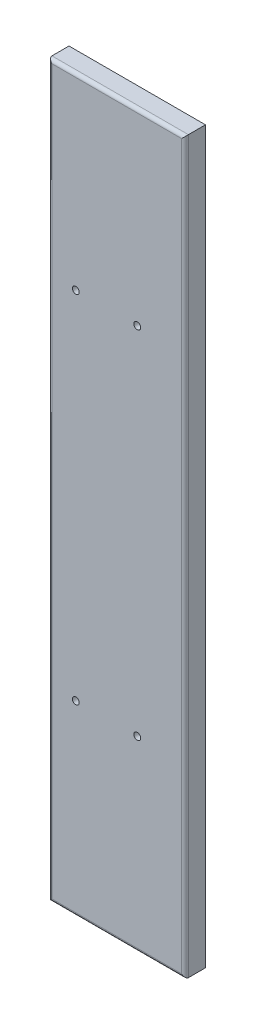
ISO-10303-21;
HEADER;
FILE_DESCRIPTION(('STEP AP214'),'2;1');
FILE_NAME('part.step','',(''),(''),'','','');
FILE_SCHEMA(('AUTOMOTIVE_DESIGN { 1 0 10303 214 1 1 1 1 }'));
ENDSEC;
DATA;
#1=APPLICATION_CONTEXT('core data for automotive mechanical design processes');
#2=APPLICATION_PROTOCOL_DEFINITION('international standard','automotive_design',2000,#1);
#3=PRODUCT_CONTEXT('',#1,'mechanical');
#4=PRODUCT('Part','Part','',(#3));
#5=PRODUCT_RELATED_PRODUCT_CATEGORY('part','',(#4));
#6=PRODUCT_DEFINITION_FORMATION('','',#4);
#7=PRODUCT_DEFINITION_CONTEXT('part definition',#1,'design');
#8=PRODUCT_DEFINITION('design','',#6,#7);
#9=PRODUCT_DEFINITION_SHAPE('','',#8);
#10=(LENGTH_UNIT() NAMED_UNIT(*) SI_UNIT(.MILLI.,.METRE.));
#11=(NAMED_UNIT(*) PLANE_ANGLE_UNIT() SI_UNIT($,.RADIAN.));
#12=(NAMED_UNIT(*) SI_UNIT($,.STERADIAN.) SOLID_ANGLE_UNIT());
#13=UNCERTAINTY_MEASURE_WITH_UNIT(LENGTH_MEASURE(1.E-05),#10,'distance_accuracy_value','');
#14=(GEOMETRIC_REPRESENTATION_CONTEXT(3) GLOBAL_UNCERTAINTY_ASSIGNED_CONTEXT((#13)) GLOBAL_UNIT_ASSIGNED_CONTEXT((#10,
#11,#12)) REPRESENTATION_CONTEXT('',''));
#15=CARTESIAN_POINT('',(0.,0.,0.));
#16=DIRECTION('',(0.,0.,1.));
#17=DIRECTION('',(1.,0.,0.));
#18=AXIS2_PLACEMENT_3D('',#15,#16,#17);
#19=CARTESIAN_POINT('',(0.,0.,19.05));
#20=DIRECTION('',(0.,0.,-1.));
#21=DIRECTION('',(-1.,0.,0.));
#22=AXIS2_PLACEMENT_3D('',#19,#20,#21);
#23=PLANE('',#22);
#24=DIRECTION('',(-1.,0.,0.));
#25=VECTOR('',#24,1.);
#26=CARTESIAN_POINT('',(73.0250000000002,-501.65,19.05));
#27=LINE('',#26,#25);
#28=CARTESIAN_POINT('',(-50.7999999999997,-501.65,19.05));
#29=VERTEX_POINT('',#28);
#30=CARTESIAN_POINT('',(69.8500000000002,-501.65,19.05));
#31=VERTEX_POINT('',#30);
#32=EDGE_CURVE('E130',#29,#31,#27,.F.);
#33=ORIENTED_EDGE('',*,*,#32,.T.);
#34=DIRECTION('',(0.,-1.,0.));
#35=VECTOR('',#34,1.);
#36=CARTESIAN_POINT('',(69.8500000000002,174.625,19.05));
#37=LINE('',#36,#35);
#38=CARTESIAN_POINT('',(69.8500000000002,171.45,19.05));
#39=VERTEX_POINT('',#38);
#40=EDGE_CURVE('E135',#31,#39,#37,.F.);
#41=ORIENTED_EDGE('',*,*,#40,.T.);
#42=DIRECTION('',(1.,0.,0.));
#43=VECTOR('',#42,1.);
#44=CARTESIAN_POINT('',(-53.9749999999997,171.45,19.05));
#45=LINE('',#44,#43);
#46=CARTESIAN_POINT('',(-50.7999999999997,171.45,19.05));
#47=VERTEX_POINT('',#46);
#48=EDGE_CURVE('E132',#39,#47,#45,.F.);
#49=ORIENTED_EDGE('',*,*,#48,.T.);
#50=DIRECTION('',(0.,1.,0.));
#51=VECTOR('',#50,1.);
#52=CARTESIAN_POINT('',(-50.7999999999997,-504.825,19.05));
#53=LINE('',#52,#51);
#54=EDGE_CURVE('E128',#47,#29,#53,.F.);
#55=ORIENTED_EDGE('',*,*,#54,.T.);
#56=EDGE_LOOP('',(#33,#41,#49,#55));
#57=FACE_BOUND('',#56,.T.);
#58=CARTESIAN_POINT('',(-28.575,2.47467228388285E-13,19.05));
#59=DIRECTION('',(0.,0.,1.));
#60=DIRECTION('',(1.,0.,0.));
#61=AXIS2_PLACEMENT_3D('',#58,#59,#60);
#62=CIRCLE('',#61,3.17499999999999);
#63=CARTESIAN_POINT('',(-25.4,2.47467228388285E-13,19.05));
#64=VERTEX_POINT('',#63);
#65=EDGE_CURVE('E154',#64,#64,#62,.T.);
#66=ORIENTED_EDGE('',*,*,#65,.F.);
#67=EDGE_LOOP('',(#66));
#68=FACE_BOUND('',#67,.T.);
#69=CARTESIAN_POINT('',(-28.575,-330.91179998754,19.05));
#70=DIRECTION('',(0.,0.,1.));
#71=DIRECTION('',(1.,0.,0.));
#72=AXIS2_PLACEMENT_3D('',#69,#70,#71);
#73=CIRCLE('',#72,3.17499999999999);
#74=CARTESIAN_POINT('',(-25.4,-330.91179998754,19.05));
#75=VERTEX_POINT('',#74);
#76=EDGE_CURVE('E176',#75,#75,#73,.T.);
#77=ORIENTED_EDGE('',*,*,#76,.F.);
#78=EDGE_LOOP('',(#77));
#79=FACE_BOUND('',#78,.T.);
#80=CARTESIAN_POINT('',(28.575,-330.91179998754,19.05));
#81=DIRECTION('',(0.,0.,1.));
#82=DIRECTION('',(1.,0.,0.));
#83=AXIS2_PLACEMENT_3D('',#80,#81,#82);
#84=CIRCLE('',#83,3.17499999999999);
#85=CARTESIAN_POINT('',(31.75,-330.91179998754,19.05));
#86=VERTEX_POINT('',#85);
#87=EDGE_CURVE('E116',#86,#86,#84,.T.);
#88=ORIENTED_EDGE('',*,*,#87,.F.);
#89=EDGE_LOOP('',(#88));
#90=FACE_BOUND('',#89,.T.);
#91=CARTESIAN_POINT('',(28.575,2.4980018054066E-13,19.05));
#92=DIRECTION('',(0.,0.,1.));
#93=DIRECTION('',(1.,0.,0.));
#94=AXIS2_PLACEMENT_3D('',#91,#92,#93);
#95=CIRCLE('',#94,3.17499999999999);
#96=CARTESIAN_POINT('',(31.75,2.4980018054066E-13,19.05));
#97=VERTEX_POINT('',#96);
#98=EDGE_CURVE('E167',#97,#97,#95,.T.);
#99=ORIENTED_EDGE('',*,*,#98,.F.);
#100=EDGE_LOOP('',(#99));
#101=FACE_BOUND('',#100,.T.);
#102=ADVANCED_FACE('F37',(#57,#68,#79,#90,#101),#23,.F.);
#103=CARTESIAN_POINT('',(-53.9749999999997,174.625,19.05));
#104=DIRECTION('',(0.,1.,0.));
#105=DIRECTION('',(0.,0.,1.));
#106=AXIS2_PLACEMENT_3D('',#103,#104,#105);
#107=PLANE('',#106);
#108=DIRECTION('',(0.,0.,-1.));
#109=VECTOR('',#108,1.);
#110=CARTESIAN_POINT('',(-53.9749999999997,174.625,19.05));
#111=LINE('',#110,#109);
#112=CARTESIAN_POINT('',(-53.9749999999997,174.625,15.875));
#113=VERTEX_POINT('',#112);
#114=CARTESIAN_POINT('',(-53.9749999999997,174.625,0.));
#115=VERTEX_POINT('',#114);
#116=EDGE_CURVE('E122',#113,#115,#111,.T.);
#117=ORIENTED_EDGE('',*,*,#116,.F.);
#118=DIRECTION('',(1.,0.,0.));
#119=VECTOR('',#118,1.);
#120=CARTESIAN_POINT('',(73.0250000000002,174.625,15.875));
#121=LINE('',#120,#119);
#122=CARTESIAN_POINT('',(73.0250000000002,174.625,15.875));
#123=VERTEX_POINT('',#122);
#124=EDGE_CURVE('E99',#113,#123,#121,.T.);
#125=ORIENTED_EDGE('',*,*,#124,.T.);
#126=DIRECTION('',(0.,0.,-1.));
#127=VECTOR('',#126,1.);
#128=CARTESIAN_POINT('',(73.0250000000002,174.625,19.05));
#129=LINE('',#128,#127);
#130=CARTESIAN_POINT('',(73.0250000000002,174.625,0.));
#131=VERTEX_POINT('',#130);
#132=EDGE_CURVE('E91',#123,#131,#129,.T.);
#133=ORIENTED_EDGE('',*,*,#132,.T.);
#134=DIRECTION('',(1.,0.,0.));
#135=VECTOR('',#134,1.);
#136=CARTESIAN_POINT('',(-53.9749999999997,174.625,0.));
#137=LINE('',#136,#135);
#138=EDGE_CURVE('E96',#115,#131,#137,.T.);
#139=ORIENTED_EDGE('',*,*,#138,.F.);
#140=EDGE_LOOP('',(#117,#125,#133,#139));
#141=FACE_BOUND('',#140,.T.);
#142=ADVANCED_FACE('F94',(#141),#107,.T.);
#143=CARTESIAN_POINT('',(-53.9749999999997,-504.825,19.05));
#144=DIRECTION('',(-1.,0.,0.));
#145=DIRECTION('',(0.,0.,1.));
#146=AXIS2_PLACEMENT_3D('',#143,#144,#145);
#147=PLANE('',#146);
#148=DIRECTION('',(0.,0.,-1.));
#149=VECTOR('',#148,1.);
#150=CARTESIAN_POINT('',(-53.9749999999997,-504.825,19.05));
#151=LINE('',#150,#149);
#152=CARTESIAN_POINT('',(-53.9749999999997,-504.825,15.875));
#153=VERTEX_POINT('',#152);
#154=CARTESIAN_POINT('',(-53.9749999999997,-504.825,0.));
#155=VERTEX_POINT('',#154);
#156=EDGE_CURVE('E124',#153,#155,#151,.T.);
#157=ORIENTED_EDGE('',*,*,#156,.F.);
#158=DIRECTION('',(0.,1.,0.));
#159=VECTOR('',#158,1.);
#160=CARTESIAN_POINT('',(-53.9749999999997,174.625,15.875));
#161=LINE('',#160,#159);
#162=EDGE_CURVE('E11',#153,#113,#161,.T.);
#163=ORIENTED_EDGE('',*,*,#162,.T.);
#164=ORIENTED_EDGE('',*,*,#116,.T.);
#165=DIRECTION('',(0.,1.,0.));
#166=VECTOR('',#165,1.);
#167=CARTESIAN_POINT('',(-53.9749999999997,-504.825,0.));
#168=LINE('',#167,#166);
#169=EDGE_CURVE('E101',#155,#115,#168,.T.);
#170=ORIENTED_EDGE('',*,*,#169,.F.);
#171=EDGE_LOOP('',(#157,#163,#164,#170));
#172=FACE_BOUND('',#171,.T.);
#173=ADVANCED_FACE('F230',(#172),#147,.T.);
#174=CARTESIAN_POINT('',(73.0250000000002,-504.825,19.05));
#175=DIRECTION('',(0.,-1.,0.));
#176=DIRECTION('',(0.,0.,-1.));
#177=AXIS2_PLACEMENT_3D('',#174,#175,#176);
#178=PLANE('',#177);
#179=DIRECTION('',(0.,0.,-1.));
#180=VECTOR('',#179,1.);
#181=CARTESIAN_POINT('',(73.0250000000002,-504.825,19.05));
#182=LINE('',#181,#180);
#183=CARTESIAN_POINT('',(73.0250000000002,-504.825,15.875));
#184=VERTEX_POINT('',#183);
#185=CARTESIAN_POINT('',(73.0250000000002,-504.825,0.));
#186=VERTEX_POINT('',#185);
#187=EDGE_CURVE('E100',#184,#186,#182,.T.);
#188=ORIENTED_EDGE('',*,*,#187,.F.);
#189=DIRECTION('',(-1.,0.,0.));
#190=VECTOR('',#189,1.);
#191=CARTESIAN_POINT('',(-53.9749999999997,-504.825,15.875));
#192=LINE('',#191,#190);
#193=EDGE_CURVE('E54',#184,#153,#192,.T.);
#194=ORIENTED_EDGE('',*,*,#193,.T.);
#195=ORIENTED_EDGE('',*,*,#156,.T.);
#196=DIRECTION('',(-1.,0.,0.));
#197=VECTOR('',#196,1.);
#198=CARTESIAN_POINT('',(73.0250000000002,-504.825,0.));
#199=LINE('',#198,#197);
#200=EDGE_CURVE('E109',#186,#155,#199,.T.);
#201=ORIENTED_EDGE('',*,*,#200,.F.);
#202=EDGE_LOOP('',(#188,#194,#195,#201));
#203=FACE_BOUND('',#202,.T.);
#204=ADVANCED_FACE('F233',(#203),#178,.T.);
#205=CARTESIAN_POINT('',(73.0250000000002,174.625,19.05));
#206=DIRECTION('',(1.,0.,0.));
#207=DIRECTION('',(0.,0.,-1.));
#208=AXIS2_PLACEMENT_3D('',#205,#206,#207);
#209=PLANE('',#208);
#210=ORIENTED_EDGE('',*,*,#132,.F.);
#211=DIRECTION('',(0.,-1.,0.));
#212=VECTOR('',#211,1.);
#213=CARTESIAN_POINT('',(73.0250000000002,-504.825,15.875));
#214=LINE('',#213,#212);
#215=EDGE_CURVE('E46',#123,#184,#214,.T.);
#216=ORIENTED_EDGE('',*,*,#215,.T.);
#217=ORIENTED_EDGE('',*,*,#187,.T.);
#218=DIRECTION('',(0.,-1.,0.));
#219=VECTOR('',#218,1.);
#220=CARTESIAN_POINT('',(73.0250000000002,174.625,0.));
#221=LINE('',#220,#219);
#222=EDGE_CURVE('E104',#131,#186,#221,.T.);
#223=ORIENTED_EDGE('',*,*,#222,.F.);
#224=EDGE_LOOP('',(#210,#216,#217,#223));
#225=FACE_BOUND('',#224,.T.);
#226=ADVANCED_FACE('F105',(#225),#209,.T.);
#227=CARTESIAN_POINT('',(0.,0.,0.));
#228=DIRECTION('',(0.,0.,-1.));
#229=DIRECTION('',(-1.,0.,0.));
#230=AXIS2_PLACEMENT_3D('',#227,#228,#229);
#231=PLANE('',#230);
#232=CARTESIAN_POINT('',(-28.575,2.47467228388285E-13,0.));
#233=DIRECTION('',(0.,0.,1.));
#234=DIRECTION('',(1.,0.,0.));
#235=AXIS2_PLACEMENT_3D('',#232,#233,#234);
#236=CIRCLE('',#235,3.937);
#237=CARTESIAN_POINT('',(-24.638,2.47467228388285E-13,0.));
#238=VERTEX_POINT('',#237);
#239=EDGE_CURVE('E148',#238,#238,#236,.T.);
#240=ORIENTED_EDGE('',*,*,#239,.T.);
#241=EDGE_LOOP('',(#240));
#242=FACE_BOUND('',#241,.T.);
#243=CARTESIAN_POINT('',(28.575,2.4980018054066E-13,0.));
#244=DIRECTION('',(0.,0.,1.));
#245=DIRECTION('',(1.,0.,0.));
#246=AXIS2_PLACEMENT_3D('',#243,#244,#245);
#247=CIRCLE('',#246,3.93699999999999);
#248=CARTESIAN_POINT('',(32.512,2.4980018054066E-13,0.));
#249=VERTEX_POINT('',#248);
#250=EDGE_CURVE('E164',#249,#249,#247,.T.);
#251=ORIENTED_EDGE('',*,*,#250,.T.);
#252=EDGE_LOOP('',(#251));
#253=FACE_BOUND('',#252,.T.);
#254=CARTESIAN_POINT('',(-28.575,-330.91179998754,0.));
#255=DIRECTION('',(0.,0.,1.));
#256=DIRECTION('',(1.,0.,0.));
#257=AXIS2_PLACEMENT_3D('',#254,#255,#256);
#258=CIRCLE('',#257,3.937);
#259=CARTESIAN_POINT('',(-24.638,-330.91179998754,0.));
#260=VERTEX_POINT('',#259);
#261=EDGE_CURVE('E173',#260,#260,#258,.T.);
#262=ORIENTED_EDGE('',*,*,#261,.T.);
#263=EDGE_LOOP('',(#262));
#264=FACE_BOUND('',#263,.T.);
#265=CARTESIAN_POINT('',(28.575,-330.91179998754,0.));
#266=DIRECTION('',(0.,0.,1.));
#267=DIRECTION('',(1.,0.,0.));
#268=AXIS2_PLACEMENT_3D('',#265,#266,#267);
#269=CIRCLE('',#268,3.93699999999999);
#270=CARTESIAN_POINT('',(32.512,-330.91179998754,0.));
#271=VERTEX_POINT('',#270);
#272=EDGE_CURVE('E182',#271,#271,#269,.T.);
#273=ORIENTED_EDGE('',*,*,#272,.T.);
#274=EDGE_LOOP('',(#273));
#275=FACE_BOUND('',#274,.T.);
#276=ORIENTED_EDGE('',*,*,#138,.T.);
#277=ORIENTED_EDGE('',*,*,#222,.T.);
#278=ORIENTED_EDGE('',*,*,#200,.T.);
#279=ORIENTED_EDGE('',*,*,#169,.T.);
#280=EDGE_LOOP('',(#276,#277,#278,#279));
#281=FACE_BOUND('',#280,.T.);
#282=ADVANCED_FACE('F111',(#242,#253,#264,#275,#281),#231,.T.);
#283=CARTESIAN_POINT('',(28.575,-330.91179998754,0.876580726302405));
#284=DIRECTION('',(0.,0.,-1.));
#285=DIRECTION('',(-1.,0.,0.));
#286=AXIS2_PLACEMENT_3D('',#283,#284,#285);
#287=CONICAL_SURFACE('',#286,3.17499999999999,0.715584993317678);
#288=ORIENTED_EDGE('',*,*,#272,.F.);
#289=EDGE_LOOP('',(#288));
#290=FACE_BOUND('',#289,.T.);
#291=CARTESIAN_POINT('',(28.575,-330.91179998754,0.876580726302405));
#292=DIRECTION('',(0.,0.,1.));
#293=DIRECTION('',(1.,0.,0.));
#294=AXIS2_PLACEMENT_3D('',#291,#292,#293);
#295=CIRCLE('',#294,3.17499999999999);
#296=CARTESIAN_POINT('',(31.75,-330.91179998754,0.876580726302405));
#297=VERTEX_POINT('',#296);
#298=EDGE_CURVE('E113',#297,#297,#295,.T.);
#299=ORIENTED_EDGE('',*,*,#298,.T.);
#300=EDGE_LOOP('',(#299));
#301=FACE_BOUND('',#300,.T.);
#302=ADVANCED_FACE('F223',(#290,#301),#287,.F.);
#303=CARTESIAN_POINT('',(28.575,-330.91179998754,19.05));
#304=DIRECTION('',(0.,0.,1.));
#305=DIRECTION('',(1.,0.,0.));
#306=AXIS2_PLACEMENT_3D('',#303,#304,#305);
#307=CYLINDRICAL_SURFACE('',#306,3.17499999999999);
#308=ORIENTED_EDGE('',*,*,#298,.F.);
#309=EDGE_LOOP('',(#308));
#310=FACE_BOUND('',#309,.T.);
#311=ORIENTED_EDGE('',*,*,#87,.T.);
#312=EDGE_LOOP('',(#311));
#313=FACE_BOUND('',#312,.T.);
#314=ADVANCED_FACE('F187',(#310,#313),#307,.F.);
#315=CARTESIAN_POINT('',(-28.575,-330.91179998754,0.876580726302405));
#316=DIRECTION('',(0.,0.,-1.));
#317=DIRECTION('',(-1.,0.,0.));
#318=AXIS2_PLACEMENT_3D('',#315,#316,#317);
#319=CONICAL_SURFACE('',#318,3.17499999999999,0.715584993317681);
#320=ORIENTED_EDGE('',*,*,#261,.F.);
#321=EDGE_LOOP('',(#320));
#322=FACE_BOUND('',#321,.T.);
#323=CARTESIAN_POINT('',(-28.575,-330.91179998754,0.876580726302405));
#324=DIRECTION('',(0.,0.,1.));
#325=DIRECTION('',(1.,0.,0.));
#326=AXIS2_PLACEMENT_3D('',#323,#324,#325);
#327=CIRCLE('',#326,3.17499999999999);
#328=CARTESIAN_POINT('',(-25.4,-330.91179998754,0.876580726302405));
#329=VERTEX_POINT('',#328);
#330=EDGE_CURVE('E179',#329,#329,#327,.T.);
#331=ORIENTED_EDGE('',*,*,#330,.T.);
#332=EDGE_LOOP('',(#331));
#333=FACE_BOUND('',#332,.T.);
#334=ADVANCED_FACE('F216',(#322,#333),#319,.F.);
#335=CARTESIAN_POINT('',(-28.575,-330.91179998754,19.05));
#336=DIRECTION('',(0.,0.,1.));
#337=DIRECTION('',(1.,0.,0.));
#338=AXIS2_PLACEMENT_3D('',#335,#336,#337);
#339=CYLINDRICAL_SURFACE('',#338,3.17499999999999);
#340=ORIENTED_EDGE('',*,*,#330,.F.);
#341=EDGE_LOOP('',(#340));
#342=FACE_BOUND('',#341,.T.);
#343=ORIENTED_EDGE('',*,*,#76,.T.);
#344=EDGE_LOOP('',(#343));
#345=FACE_BOUND('',#344,.T.);
#346=ADVANCED_FACE('F208',(#342,#345),#339,.F.);
#347=CARTESIAN_POINT('',(28.575,2.4980018054066E-13,0.876580726302405));
#348=DIRECTION('',(0.,0.,-1.));
#349=DIRECTION('',(-1.,0.,0.));
#350=AXIS2_PLACEMENT_3D('',#347,#348,#349);
#351=CONICAL_SURFACE('',#350,3.17499999999999,0.715584993317678);
#352=ORIENTED_EDGE('',*,*,#250,.F.);
#353=EDGE_LOOP('',(#352));
#354=FACE_BOUND('',#353,.T.);
#355=CARTESIAN_POINT('',(28.575,2.4980018054066E-13,0.876580726302405));
#356=DIRECTION('',(0.,0.,1.));
#357=DIRECTION('',(1.,0.,0.));
#358=AXIS2_PLACEMENT_3D('',#355,#356,#357);
#359=CIRCLE('',#358,3.17499999999999);
#360=CARTESIAN_POINT('',(31.75,2.4980018054066E-13,0.876580726302405));
#361=VERTEX_POINT('',#360);
#362=EDGE_CURVE('E170',#361,#361,#359,.T.);
#363=ORIENTED_EDGE('',*,*,#362,.T.);
#364=EDGE_LOOP('',(#363));
#365=FACE_BOUND('',#364,.T.);
#366=ADVANCED_FACE('F198',(#354,#365),#351,.F.);
#367=CARTESIAN_POINT('',(28.575,2.4980018054066E-13,19.05));
#368=DIRECTION('',(0.,0.,1.));
#369=DIRECTION('',(1.,0.,0.));
#370=AXIS2_PLACEMENT_3D('',#367,#368,#369);
#371=CYLINDRICAL_SURFACE('',#370,3.17499999999999);
#372=ORIENTED_EDGE('',*,*,#362,.F.);
#373=EDGE_LOOP('',(#372));
#374=FACE_BOUND('',#373,.T.);
#375=ORIENTED_EDGE('',*,*,#98,.T.);
#376=EDGE_LOOP('',(#375));
#377=FACE_BOUND('',#376,.T.);
#378=ADVANCED_FACE('F195',(#374,#377),#371,.F.);
#379=CARTESIAN_POINT('',(-28.575,2.47467228388285E-13,0.876580726302405));
#380=DIRECTION('',(0.,0.,-1.));
#381=DIRECTION('',(-1.,0.,0.));
#382=AXIS2_PLACEMENT_3D('',#379,#380,#381);
#383=CONICAL_SURFACE('',#382,3.17499999999999,0.715584993317681);
#384=ORIENTED_EDGE('',*,*,#239,.F.);
#385=EDGE_LOOP('',(#384));
#386=FACE_BOUND('',#385,.T.);
#387=CARTESIAN_POINT('',(-28.575,2.47467228388285E-13,0.876580726302405));
#388=DIRECTION('',(0.,0.,1.));
#389=DIRECTION('',(1.,0.,0.));
#390=AXIS2_PLACEMENT_3D('',#387,#388,#389);
#391=CIRCLE('',#390,3.17499999999999);
#392=CARTESIAN_POINT('',(-25.4,2.47467228388285E-13,0.876580726302405));
#393=VERTEX_POINT('',#392);
#394=EDGE_CURVE('E159',#393,#393,#391,.T.);
#395=ORIENTED_EDGE('',*,*,#394,.T.);
#396=EDGE_LOOP('',(#395));
#397=FACE_BOUND('',#396,.T.);
#398=ADVANCED_FACE('F197',(#386,#397),#383,.F.);
#399=CARTESIAN_POINT('',(-28.575,2.47467228388285E-13,19.05));
#400=DIRECTION('',(0.,0.,1.));
#401=DIRECTION('',(1.,0.,0.));
#402=AXIS2_PLACEMENT_3D('',#399,#400,#401);
#403=CYLINDRICAL_SURFACE('',#402,3.17499999999999);
#404=ORIENTED_EDGE('',*,*,#394,.F.);
#405=EDGE_LOOP('',(#404));
#406=FACE_BOUND('',#405,.T.);
#407=ORIENTED_EDGE('',*,*,#65,.T.);
#408=EDGE_LOOP('',(#407));
#409=FACE_BOUND('',#408,.T.);
#410=ADVANCED_FACE('F205',(#406,#409),#403,.F.);
#411=CARTESIAN_POINT('',(73.0250000000002,-501.65,15.875));
#412=DIRECTION('',(1.,0.,0.));
#413=DIRECTION('',(0.,0.,-1.));
#414=AXIS2_PLACEMENT_3D('',#411,#412,#413);
#415=CYLINDRICAL_SURFACE('',#414,3.175);
#416=CARTESIAN_POINT('',(69.8500000000002,-501.65,15.875));
#417=DIRECTION('',(0.707106781186547,0.707106781186547,0.));
#418=DIRECTION('',(-0.707106781186547,0.707106781186547,0.));
#419=AXIS2_PLACEMENT_3D('',#416,#417,#418);
#420=ELLIPSE('',#419,4.49012806053458,3.175);
#421=EDGE_CURVE('E142',#31,#184,#420,.T.);
#422=ORIENTED_EDGE('',*,*,#421,.F.);
#423=ORIENTED_EDGE('',*,*,#32,.F.);
#424=CARTESIAN_POINT('',(-50.7999999999997,-501.65,15.875));
#425=DIRECTION('',(0.707106781186547,-0.707106781186547,0.));
#426=DIRECTION('',(-0.707106781186547,-0.707106781186547,0.));
#427=AXIS2_PLACEMENT_3D('',#424,#425,#426);
#428=ELLIPSE('',#427,4.49012806053458,3.175);
#429=EDGE_CURVE('E41',#153,#29,#428,.F.);
#430=ORIENTED_EDGE('',*,*,#429,.F.);
#431=ORIENTED_EDGE('',*,*,#193,.F.);
#432=EDGE_LOOP('',(#422,#423,#430,#431));
#433=FACE_BOUND('',#432,.T.);
#434=ADVANCED_FACE('F39',(#433),#415,.T.);
#435=CARTESIAN_POINT('',(-50.7999999999997,-504.825,15.875));
#436=DIRECTION('',(0.,-1.,0.));
#437=DIRECTION('',(0.,0.,-1.));
#438=AXIS2_PLACEMENT_3D('',#435,#436,#437);
#439=CYLINDRICAL_SURFACE('',#438,3.175);
#440=ORIENTED_EDGE('',*,*,#429,.T.);
#441=ORIENTED_EDGE('',*,*,#54,.F.);
#442=CARTESIAN_POINT('',(-50.7999999999997,171.45,15.875));
#443=DIRECTION('',(-0.707106781186547,-0.707106781186547,0.));
#444=DIRECTION('',(0.707106781186547,-0.707106781186547,0.));
#445=AXIS2_PLACEMENT_3D('',#442,#443,#444);
#446=ELLIPSE('',#445,4.49012806053458,3.175);
#447=EDGE_CURVE('E141',#113,#47,#446,.F.);
#448=ORIENTED_EDGE('',*,*,#447,.F.);
#449=ORIENTED_EDGE('',*,*,#162,.F.);
#450=EDGE_LOOP('',(#440,#441,#448,#449));
#451=FACE_BOUND('',#450,.T.);
#452=ADVANCED_FACE('F247',(#451),#439,.T.);
#453=CARTESIAN_POINT('',(69.8500000000002,174.625,15.875));
#454=DIRECTION('',(0.,1.,0.));
#455=DIRECTION('',(0.,0.,1.));
#456=AXIS2_PLACEMENT_3D('',#453,#454,#455);
#457=CYLINDRICAL_SURFACE('',#456,3.175);
#458=ORIENTED_EDGE('',*,*,#421,.T.);
#459=ORIENTED_EDGE('',*,*,#215,.F.);
#460=CARTESIAN_POINT('',(69.8500000000002,171.45,15.875));
#461=DIRECTION('',(-0.707106781186547,0.707106781186547,0.));
#462=DIRECTION('',(0.707106781186547,0.707106781186547,0.));
#463=AXIS2_PLACEMENT_3D('',#460,#461,#462);
#464=ELLIPSE('',#463,4.49012806053458,3.175);
#465=EDGE_CURVE('E139',#39,#123,#464,.T.);
#466=ORIENTED_EDGE('',*,*,#465,.F.);
#467=ORIENTED_EDGE('',*,*,#40,.F.);
#468=EDGE_LOOP('',(#458,#459,#466,#467));
#469=FACE_BOUND('',#468,.T.);
#470=ADVANCED_FACE('F244',(#469),#457,.T.);
#471=CARTESIAN_POINT('',(-53.9749999999997,171.45,15.875));
#472=DIRECTION('',(-1.,0.,0.));
#473=DIRECTION('',(0.,0.,1.));
#474=AXIS2_PLACEMENT_3D('',#471,#472,#473);
#475=CYLINDRICAL_SURFACE('',#474,3.175);
#476=ORIENTED_EDGE('',*,*,#447,.T.);
#477=ORIENTED_EDGE('',*,*,#48,.F.);
#478=ORIENTED_EDGE('',*,*,#465,.T.);
#479=ORIENTED_EDGE('',*,*,#124,.F.);
#480=EDGE_LOOP('',(#476,#477,#478,#479));
#481=FACE_BOUND('',#480,.T.);
#482=ADVANCED_FACE('F241',(#481),#475,.T.);
#483=CLOSED_SHELL('',(#102,#142,#173,#204,#226,#282,#302,#314,#334,#346,#366,#378,#398,#410,
#434,#452,#470,#482));
#484=MANIFOLD_SOLID_BREP('B2',#483);
#485=ADVANCED_BREP_SHAPE_REPRESENTATION('',(#18,#484),#14);
#486=SHAPE_DEFINITION_REPRESENTATION(#9,#485);
ENDSEC;
END-ISO-10303-21;
